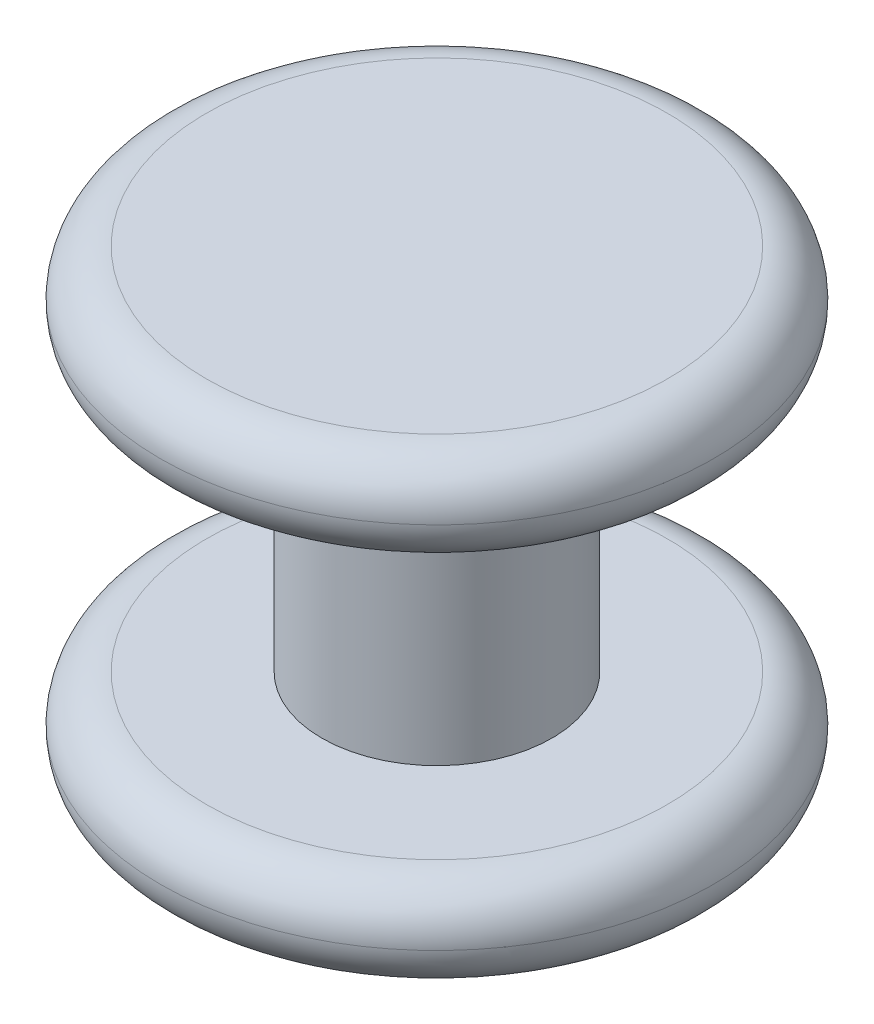
ISO-10303-21;
HEADER;
FILE_DESCRIPTION(('STEP AP214'),'2;1');
FILE_NAME('part.step','',(''),(''),'','','');
FILE_SCHEMA(('AUTOMOTIVE_DESIGN { 1 0 10303 214 1 1 1 1 }'));
ENDSEC;
DATA;
#1=APPLICATION_CONTEXT('core data for automotive mechanical design processes');
#2=APPLICATION_PROTOCOL_DEFINITION('international standard','automotive_design',2000,#1);
#3=PRODUCT_CONTEXT('',#1,'mechanical');
#4=PRODUCT('Part','Part','',(#3));
#5=PRODUCT_RELATED_PRODUCT_CATEGORY('part','',(#4));
#6=PRODUCT_DEFINITION_FORMATION('','',#4);
#7=PRODUCT_DEFINITION_CONTEXT('part definition',#1,'design');
#8=PRODUCT_DEFINITION('design','',#6,#7);
#9=PRODUCT_DEFINITION_SHAPE('','',#8);
#10=(LENGTH_UNIT() NAMED_UNIT(*) SI_UNIT(.MILLI.,.METRE.));
#11=(NAMED_UNIT(*) PLANE_ANGLE_UNIT() SI_UNIT($,.RADIAN.));
#12=(NAMED_UNIT(*) SI_UNIT($,.STERADIAN.) SOLID_ANGLE_UNIT());
#13=UNCERTAINTY_MEASURE_WITH_UNIT(LENGTH_MEASURE(1.E-05),#10,'distance_accuracy_value','');
#14=(GEOMETRIC_REPRESENTATION_CONTEXT(3) GLOBAL_UNCERTAINTY_ASSIGNED_CONTEXT((#13)) GLOBAL_UNIT_ASSIGNED_CONTEXT((#10,
#11,#12)) REPRESENTATION_CONTEXT('',''));
#15=CARTESIAN_POINT('',(0.,0.,0.));
#16=DIRECTION('',(0.,0.,1.));
#17=DIRECTION('',(1.,0.,0.));
#18=AXIS2_PLACEMENT_3D('',#15,#16,#17);
#19=CARTESIAN_POINT('',(0.,3.,0.));
#20=DIRECTION('',(0.,-1.,0.));
#21=DIRECTION('',(0.,0.,-1.));
#22=AXIS2_PLACEMENT_3D('',#19,#20,#21);
#23=CYLINDRICAL_SURFACE('',#22,2.5);
#24=CARTESIAN_POINT('',(0.,3.,0.));
#25=DIRECTION('',(0.,1.,0.));
#26=DIRECTION('',(0.,0.,1.));
#27=AXIS2_PLACEMENT_3D('',#24,#25,#26);
#28=CIRCLE('',#27,2.5);
#29=CARTESIAN_POINT('',(0.,3.,2.5));
#30=VERTEX_POINT('',#29);
#31=EDGE_CURVE('E43',#30,#30,#28,.T.);
#32=ORIENTED_EDGE('',*,*,#31,.F.);
#33=EDGE_LOOP('',(#32));
#34=FACE_BOUND('',#33,.T.);
#35=CARTESIAN_POINT('',(0.,-3.,0.));
#36=DIRECTION('',(0.,1.,0.));
#37=DIRECTION('',(0.,0.,1.));
#38=AXIS2_PLACEMENT_3D('',#35,#36,#37);
#39=CIRCLE('',#38,2.5);
#40=CARTESIAN_POINT('',(0.,-3.,2.5));
#41=VERTEX_POINT('',#40);
#42=EDGE_CURVE('E51',#41,#41,#39,.T.);
#43=ORIENTED_EDGE('',*,*,#42,.T.);
#44=EDGE_LOOP('',(#43));
#45=FACE_BOUND('',#44,.T.);
#46=ADVANCED_FACE('F31',(#34,#45),#23,.T.);
#47=CARTESIAN_POINT('',(0.,5.,0.));
#48=DIRECTION('',(0.,1.,0.));
#49=DIRECTION('',(0.,0.,1.));
#50=AXIS2_PLACEMENT_3D('',#47,#48,#49);
#51=PLANE('',#50);
#52=CARTESIAN_POINT('',(0.,5.,0.));
#53=DIRECTION('',(0.,1.,0.));
#54=DIRECTION('',(0.,0.,1.));
#55=AXIS2_PLACEMENT_3D('',#52,#53,#54);
#56=CIRCLE('',#55,5.);
#57=CARTESIAN_POINT('',(0.,5.,5.));
#58=VERTEX_POINT('',#57);
#59=EDGE_CURVE('E39',#58,#58,#56,.T.);
#60=ORIENTED_EDGE('',*,*,#59,.T.);
#61=EDGE_LOOP('',(#60));
#62=FACE_BOUND('',#61,.T.);
#63=ADVANCED_FACE('F81',(#62),#51,.T.);
#64=CARTESIAN_POINT('',(0.,3.,0.));
#65=DIRECTION('',(0.,1.,0.));
#66=DIRECTION('',(0.,0.,1.));
#67=AXIS2_PLACEMENT_3D('',#64,#65,#66);
#68=PLANE('',#67);
#69=CARTESIAN_POINT('',(0.,3.,0.));
#70=DIRECTION('',(0.,1.,0.));
#71=DIRECTION('',(0.,0.,1.));
#72=AXIS2_PLACEMENT_3D('',#69,#70,#71);
#73=CIRCLE('',#72,5.);
#74=CARTESIAN_POINT('',(0.,3.,5.));
#75=VERTEX_POINT('',#74);
#76=EDGE_CURVE('E10',#75,#75,#73,.F.);
#77=ORIENTED_EDGE('',*,*,#76,.T.);
#78=EDGE_LOOP('',(#77));
#79=FACE_BOUND('',#78,.T.);
#80=ORIENTED_EDGE('',*,*,#31,.T.);
#81=EDGE_LOOP('',(#80));
#82=FACE_BOUND('',#81,.T.);
#83=ADVANCED_FACE('F87',(#79,#82),#68,.F.);
#84=CARTESIAN_POINT('',(0.,4.,0.));
#85=DIRECTION('',(0.,1.,0.));
#86=DIRECTION('',(0.,0.,1.));
#87=AXIS2_PLACEMENT_3D('',#84,#85,#86);
#88=TOROIDAL_SURFACE('',#87,5.,1.);
#89=ORIENTED_EDGE('',*,*,#76,.F.);
#90=EDGE_LOOP('',(#89));
#91=FACE_BOUND('',#90,.T.);
#92=CARTESIAN_POINT('',(0.,4.,0.));
#93=DIRECTION('',(0.,1.,0.));
#94=DIRECTION('',(0.,0.,1.));
#95=AXIS2_PLACEMENT_3D('',#92,#93,#94);
#96=CIRCLE('',#95,6.);
#97=CARTESIAN_POINT('',(0.,4.,6.));
#98=VERTEX_POINT('',#97);
#99=EDGE_CURVE('E35',#98,#98,#96,.T.);
#100=ORIENTED_EDGE('',*,*,#99,.F.);
#101=EDGE_LOOP('',(#100));
#102=FACE_BOUND('',#101,.T.);
#103=ADVANCED_FACE('F33',(#91,#102),#88,.T.);
#104=CARTESIAN_POINT('',(0.,4.,0.));
#105=DIRECTION('',(0.,1.,0.));
#106=DIRECTION('',(0.,0.,1.));
#107=AXIS2_PLACEMENT_3D('',#104,#105,#106);
#108=TOROIDAL_SURFACE('',#107,5.,1.);
#109=ORIENTED_EDGE('',*,*,#99,.T.);
#110=EDGE_LOOP('',(#109));
#111=FACE_BOUND('',#110,.T.);
#112=ORIENTED_EDGE('',*,*,#59,.F.);
#113=EDGE_LOOP('',(#112));
#114=FACE_BOUND('',#113,.T.);
#115=ADVANCED_FACE('F75',(#111,#114),#108,.T.);
#116=CARTESIAN_POINT('',(0.,-5.,0.));
#117=DIRECTION('',(0.,-1.,0.));
#118=DIRECTION('',(0.,0.,1.));
#119=AXIS2_PLACEMENT_3D('',#116,#117,#118);
#120=PLANE('',#119);
#121=CARTESIAN_POINT('',(0.,-5.,0.));
#122=DIRECTION('',(0.,1.,0.));
#123=DIRECTION('',(0.,0.,1.));
#124=AXIS2_PLACEMENT_3D('',#121,#122,#123);
#125=CIRCLE('',#124,5.);
#126=CARTESIAN_POINT('',(0.,-5.,5.));
#127=VERTEX_POINT('',#126);
#128=EDGE_CURVE('E55',#127,#127,#125,.T.);
#129=ORIENTED_EDGE('',*,*,#128,.F.);
#130=EDGE_LOOP('',(#129));
#131=FACE_BOUND('',#130,.T.);
#132=ADVANCED_FACE('F65',(#131),#120,.T.);
#133=CARTESIAN_POINT('',(0.,-3.,0.));
#134=DIRECTION('',(0.,-1.,0.));
#135=DIRECTION('',(0.,0.,1.));
#136=AXIS2_PLACEMENT_3D('',#133,#134,#135);
#137=PLANE('',#136);
#138=CARTESIAN_POINT('',(0.,-3.,0.));
#139=DIRECTION('',(0.,1.,0.));
#140=DIRECTION('',(0.,0.,1.));
#141=AXIS2_PLACEMENT_3D('',#138,#139,#140);
#142=CIRCLE('',#141,5.);
#143=CARTESIAN_POINT('',(0.,-3.,5.));
#144=VERTEX_POINT('',#143);
#145=EDGE_CURVE('E52',#144,#144,#142,.F.);
#146=ORIENTED_EDGE('',*,*,#145,.F.);
#147=EDGE_LOOP('',(#146));
#148=FACE_BOUND('',#147,.T.);
#149=ORIENTED_EDGE('',*,*,#42,.F.);
#150=EDGE_LOOP('',(#149));
#151=FACE_BOUND('',#150,.T.);
#152=ADVANCED_FACE('F62',(#148,#151),#137,.F.);
#153=CARTESIAN_POINT('',(0.,-4.,0.));
#154=DIRECTION('',(0.,-1.,0.));
#155=DIRECTION('',(0.,0.,1.));
#156=AXIS2_PLACEMENT_3D('',#153,#154,#155);
#157=TOROIDAL_SURFACE('',#156,5.,1.);
#158=ORIENTED_EDGE('',*,*,#145,.T.);
#159=EDGE_LOOP('',(#158));
#160=FACE_BOUND('',#159,.T.);
#161=CARTESIAN_POINT('',(0.,-4.,0.));
#162=DIRECTION('',(0.,1.,0.));
#163=DIRECTION('',(0.,0.,1.));
#164=AXIS2_PLACEMENT_3D('',#161,#162,#163);
#165=CIRCLE('',#164,6.);
#166=CARTESIAN_POINT('',(0.,-4.,6.));
#167=VERTEX_POINT('',#166);
#168=EDGE_CURVE('E48',#167,#167,#165,.T.);
#169=ORIENTED_EDGE('',*,*,#168,.T.);
#170=EDGE_LOOP('',(#169));
#171=FACE_BOUND('',#170,.T.);
#172=ADVANCED_FACE('F64',(#160,#171),#157,.T.);
#173=CARTESIAN_POINT('',(0.,-4.,0.));
#174=DIRECTION('',(0.,-1.,0.));
#175=DIRECTION('',(0.,0.,1.));
#176=AXIS2_PLACEMENT_3D('',#173,#174,#175);
#177=TOROIDAL_SURFACE('',#176,5.,1.);
#178=ORIENTED_EDGE('',*,*,#168,.F.);
#179=EDGE_LOOP('',(#178));
#180=FACE_BOUND('',#179,.T.);
#181=ORIENTED_EDGE('',*,*,#128,.T.);
#182=EDGE_LOOP('',(#181));
#183=FACE_BOUND('',#182,.T.);
#184=ADVANCED_FACE('F72',(#180,#183),#177,.T.);
#185=CLOSED_SHELL('',(#46,#63,#83,#103,#115,#132,#152,#172,#184));
#186=MANIFOLD_SOLID_BREP('B2',#185);
#187=ADVANCED_BREP_SHAPE_REPRESENTATION('',(#18,#186),#14);
#188=SHAPE_DEFINITION_REPRESENTATION(#9,#187);
ENDSEC;
END-ISO-10303-21;
